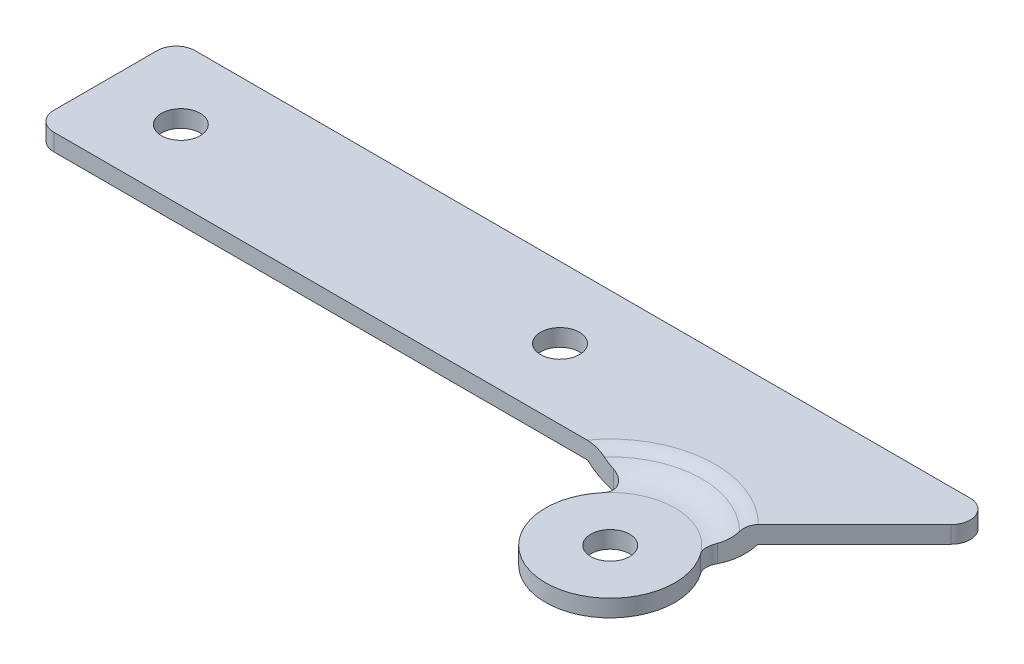
ISO-10303-21;
HEADER;
FILE_DESCRIPTION(('STEP AP214'),'2;1');
FILE_NAME('part.step','',(''),(''),'','','');
FILE_SCHEMA(('AUTOMOTIVE_DESIGN { 1 0 10303 214 1 1 1 1 }'));
ENDSEC;
DATA;
#1=APPLICATION_CONTEXT('core data for automotive mechanical design processes');
#2=APPLICATION_PROTOCOL_DEFINITION('international standard','automotive_design',2000,#1);
#3=PRODUCT_CONTEXT('',#1,'mechanical');
#4=PRODUCT('Part','Part','',(#3));
#5=PRODUCT_RELATED_PRODUCT_CATEGORY('part','',(#4));
#6=PRODUCT_DEFINITION_FORMATION('','',#4);
#7=PRODUCT_DEFINITION_CONTEXT('part definition',#1,'design');
#8=PRODUCT_DEFINITION('design','',#6,#7);
#9=PRODUCT_DEFINITION_SHAPE('','',#8);
#10=(LENGTH_UNIT() NAMED_UNIT(*) SI_UNIT(.MILLI.,.METRE.));
#11=(NAMED_UNIT(*) PLANE_ANGLE_UNIT() SI_UNIT($,.RADIAN.));
#12=(NAMED_UNIT(*) SI_UNIT($,.STERADIAN.) SOLID_ANGLE_UNIT());
#13=UNCERTAINTY_MEASURE_WITH_UNIT(LENGTH_MEASURE(1.E-05),#10,'distance_accuracy_value','');
#14=(GEOMETRIC_REPRESENTATION_CONTEXT(3) GLOBAL_UNCERTAINTY_ASSIGNED_CONTEXT((#13)) GLOBAL_UNIT_ASSIGNED_CONTEXT((#10,
#11,#12)) REPRESENTATION_CONTEXT('',''));
#15=CARTESIAN_POINT('',(0.,0.,0.));
#16=DIRECTION('',(0.,0.,1.));
#17=DIRECTION('',(1.,0.,0.));
#18=AXIS2_PLACEMENT_3D('',#15,#16,#17);
#19=CARTESIAN_POINT('',(44.4503952922486,-2.66700000003041,17.653));
#20=DIRECTION('',(0.,1.,0.));
#21=DIRECTION('',(0.,0.,1.));
#22=AXIS2_PLACEMENT_3D('',#19,#20,#21);
#23=CYLINDRICAL_SURFACE('',#22,2.6035);
#24=CARTESIAN_POINT('',(44.4503952922486,-2.41300000003041,17.653));
#25=DIRECTION('',(0.,1.,0.));
#26=DIRECTION('',(0.,0.,1.));
#27=AXIS2_PLACEMENT_3D('',#24,#25,#26);
#28=CIRCLE('',#27,2.6035);
#29=CARTESIAN_POINT('',(44.4503952922486,-2.41300000003041,20.2565));
#30=VERTEX_POINT('',#29);
#31=EDGE_CURVE('E474',#30,#30,#28,.T.);
#32=ORIENTED_EDGE('',*,*,#31,.F.);
#33=EDGE_LOOP('',(#32));
#34=FACE_BOUND('',#33,.T.);
#35=CARTESIAN_POINT('',(44.4503952922486,-0.12700000003041,17.653));
#36=DIRECTION('',(0.,1.,0.));
#37=DIRECTION('',(0.,0.,1.));
#38=AXIS2_PLACEMENT_3D('',#35,#36,#37);
#39=CIRCLE('',#38,2.6035);
#40=CARTESIAN_POINT('',(44.4503952922486,-0.12700000003041,20.2565));
#41=VERTEX_POINT('',#40);
#42=EDGE_CURVE('E20',#41,#41,#39,.T.);
#43=ORIENTED_EDGE('',*,*,#42,.T.);
#44=EDGE_LOOP('',(#43));
#45=FACE_BOUND('',#44,.T.);
#46=ADVANCED_FACE('F17',(#34,#45),#23,.F.);
#47=CARTESIAN_POINT('',(44.4503952922486,-0.12700000003041,17.653));
#48=DIRECTION('',(0.,-1.,0.));
#49=DIRECTION('',(0.,0.,-1.));
#50=AXIS2_PLACEMENT_3D('',#47,#48,#49);
#51=PLANE('',#50);
#52=CARTESIAN_POINT('',(44.4503952922486,-0.12700000003041,17.653));
#53=DIRECTION('',(0.,-1.,0.));
#54=DIRECTION('',(-0.760302428804956,0.,-0.649569254778337));
#55=AXIS2_PLACEMENT_3D('',#52,#53,#54);
#56=CIRCLE('',#55,8.67699443373865);
#57=CARTESIAN_POINT('',(51.4610548897929,-0.12700000003041,12.54018429723));
#58=VERTEX_POINT('',#57);
#59=CARTESIAN_POINT('',(37.85325534955,-0.12700000003041,12.0166911919606));
#60=VERTEX_POINT('',#59);
#61=EDGE_CURVE('E125',#58,#60,#56,.F.);
#62=ORIENTED_EDGE('',*,*,#61,.T.);
#63=CARTESIAN_POINT('',(44.4503952922486,-0.12700000003041,17.653));
#64=DIRECTION('',(0.,1.,0.));
#65=DIRECTION('',(0.,0.,1.));
#66=AXIS2_PLACEMENT_3D('',#63,#64,#65);
#67=CIRCLE('',#66,8.67699443373867);
#68=EDGE_CURVE('E120',#58,#60,#67,.F.);
#69=ORIENTED_EDGE('',*,*,#68,.F.);
#70=EDGE_LOOP('',(#62,#69));
#71=FACE_BOUND('',#70,.T.);
#72=ORIENTED_EDGE('',*,*,#42,.F.);
#73=EDGE_LOOP('',(#72));
#74=FACE_BOUND('',#73,.T.);
#75=ADVANCED_FACE('F122',(#71,#74),#51,.F.);
#76=CARTESIAN_POINT('',(44.4503952922486,-2.41300000003041,17.653));
#77=DIRECTION('',(0.,-1.,0.));
#78=DIRECTION('',(0.,0.,-1.));
#79=AXIS2_PLACEMENT_3D('',#76,#77,#78);
#80=PLANE('',#79);
#81=CARTESIAN_POINT('',(44.4503952922486,-2.41300000003041,17.653));
#82=DIRECTION('',(0.,1.,0.));
#83=DIRECTION('',(0.807959443915838,0.,-0.589238098723436));
#84=AXIS2_PLACEMENT_3D('',#81,#82,#83);
#85=CIRCLE('',#84,8.67699443373865);
#86=CARTESIAN_POINT('',(51.4610548897929,-2.41300000003041,12.54018429723));
#87=VERTEX_POINT('',#86);
#88=CARTESIAN_POINT('',(37.85325534955,-2.41300000003041,12.0166911919606));
#89=VERTEX_POINT('',#88);
#90=EDGE_CURVE('E247',#87,#89,#85,.T.);
#91=ORIENTED_EDGE('',*,*,#90,.F.);
#92=CARTESIAN_POINT('',(44.4503952922486,-2.41300000003041,17.653));
#93=DIRECTION('',(0.,1.,0.));
#94=DIRECTION('',(0.,0.,1.));
#95=AXIS2_PLACEMENT_3D('',#92,#93,#94);
#96=CIRCLE('',#95,8.67699443373867);
#97=EDGE_CURVE('E132',#89,#87,#96,.T.);
#98=ORIENTED_EDGE('',*,*,#97,.F.);
#99=EDGE_LOOP('',(#91,#98));
#100=FACE_BOUND('',#99,.T.);
#101=ORIENTED_EDGE('',*,*,#31,.T.);
#102=EDGE_LOOP('',(#101));
#103=FACE_BOUND('',#102,.T.);
#104=ADVANCED_FACE('F252',(#100,#103),#80,.T.);
#105=CARTESIAN_POINT('',(44.4503952922486,-2.41300000003041,17.653));
#106=DIRECTION('',(0.,1.,0.));
#107=DIRECTION('',(0.,0.,1.));
#108=AXIS2_PLACEMENT_3D('',#105,#106,#107);
#109=CYLINDRICAL_SURFACE('',#108,8.67699443373867);
#110=ORIENTED_EDGE('',*,*,#68,.T.);
#111=DIRECTION('',(0.,1.,0.));
#112=VECTOR('',#111,1.);
#113=CARTESIAN_POINT('',(37.85325534955,-2.41300000003041,12.0166911919606));
#114=LINE('',#113,#112);
#115=EDGE_CURVE('E403',#60,#89,#114,.F.);
#116=ORIENTED_EDGE('',*,*,#115,.T.);
#117=ORIENTED_EDGE('',*,*,#97,.T.);
#118=DIRECTION('',(0.,1.,0.));
#119=VECTOR('',#118,1.);
#120=CARTESIAN_POINT('',(51.4610548897929,-2.41300000003041,12.54018429723));
#121=LINE('',#120,#119);
#122=EDGE_CURVE('E135',#87,#58,#121,.T.);
#123=ORIENTED_EDGE('',*,*,#122,.T.);
#124=EDGE_LOOP('',(#110,#116,#117,#123));
#125=FACE_BOUND('',#124,.T.);
#126=ADVANCED_FACE('F136',(#125),#109,.T.);
#127=CARTESIAN_POINT('',(44.4503952922486,-0.10160000003041,17.653));
#128=DIRECTION('',(0.,1.,0.));
#129=DIRECTION('',(0.,0.,1.));
#130=AXIS2_PLACEMENT_3D('',#127,#128,#129);
#131=TOROIDAL_SURFACE('',#130,14.0384404886757,0.1016);
#132=CARTESIAN_POINT('',(44.4503952922486,-0.0342269503850086,17.653));
#133=DIRECTION('',(0.,1.,0.));
#134=DIRECTION('',(0.,0.,1.));
#135=AXIS2_PLACEMENT_3D('',#132,#133,#134);
#136=CIRCLE('',#135,13.9623916084639);
#137=CARTESIAN_POINT('',(33.1896957390192,-0.0342269503850142,9.398));
#138=VERTEX_POINT('',#137);
#139=CARTESIAN_POINT('',(54.3232970801755,-0.0342269503850124,7.78009821207306));
#140=VERTEX_POINT('',#139);
#141=EDGE_CURVE('E156',#138,#140,#136,.F.);
#142=ORIENTED_EDGE('',*,*,#141,.F.);
#143=CARTESIAN_POINT('',(33.0955379019468,-3.04095941136562E-11,9.398));
#144=CARTESIAN_POINT('',(33.1043058847219,-4.27830514717296E-06,9.39800000000726));
#145=CARTESIAN_POINT('',(33.1130825409415,-0.000743526853356374,9.39800000000448));
#146=CARTESIAN_POINT('',(33.1300958473547,-0.0036709579785329,9.39799999999567));
#147=CARTESIAN_POINT('',(33.1383407823322,-0.00581152404819654,9.39799999998976));
#148=CARTESIAN_POINT('',(33.1541613388357,-0.0114570274934798,9.39799999998993));
#149=CARTESIAN_POINT('',(33.161747607659,-0.0149313235804316,9.39799999999576));
#150=CARTESIAN_POINT('',(33.176344334753,-0.0233994876074103,9.39800000000438));
#151=CARTESIAN_POINT('',(33.1833280256187,-0.028439120987053,9.39800000000707));
#152=CARTESIAN_POINT('',(33.1896957390192,-0.0342269503850202,9.398));
#153=B_SPLINE_CURVE_WITH_KNOTS('',3,(#143,#144,#145,#146,#147,#148,#149,#150,#151,#152),
.UNSPECIFIED.,.F.,.F.,(4,2,2,2,4),(0.,0.0262859342628319,0.0517220480256204,0.07660573628006,
0.102299088490653),.UNSPECIFIED.);
#154=CARTESIAN_POINT('',(33.0955379019468,-2.41195518418946E-11,9.398));
#155=VERTEX_POINT('',#154);
#156=EDGE_CURVE('E131',#155,#138,#153,.T.);
#157=ORIENTED_EDGE('',*,*,#156,.F.);
#158=CARTESIAN_POINT('',(44.4503952922486,-3.04095941136562E-11,17.653));
#159=DIRECTION('',(0.,-1.,0.));
#160=DIRECTION('',(-0.808840369374453,0.,-0.588028278971512));
#161=AXIS2_PLACEMENT_3D('',#158,#159,#160);
#162=CIRCLE('',#161,14.0384404886757);
#163=CARTESIAN_POINT('',(54.377071759075,-2.43275451866642E-11,7.72632353317358));
#164=VERTEX_POINT('',#163);
#165=EDGE_CURVE('E400',#155,#164,#162,.T.);
#166=ORIENTED_EDGE('',*,*,#165,.T.);
#167=CARTESIAN_POINT('',(54.3232970801755,-0.0342269503850163,7.78009821207306));
#168=CARTESIAN_POINT('',(54.325973634849,-0.0299468639125701,7.77742165739962));
#169=CARTESIAN_POINT('',(54.3289096105983,-0.0259938620795694,7.77448568165028));
#170=CARTESIAN_POINT('',(54.3352073993302,-0.0188372784984353,7.76818789291843));
#171=CARTESIAN_POINT('',(54.3385691977223,-0.0156336710837642,7.76482609452631));
#172=CARTESIAN_POINT('',(54.3456283380042,-0.010068838204077,7.75776695424438));
#173=CARTESIAN_POINT('',(54.3493259173711,-0.00770821484155102,7.75406937487751));
#174=CARTESIAN_POINT('',(54.3569435989417,-0.0039026409279243,7.74645169330685));
#175=CARTESIAN_POINT('',(54.360863384598,-0.0024564217750087,7.7425319076506));
#176=CARTESIAN_POINT('',(54.3688777722828,-0.000495469669809619,7.73451751996583));
#177=CARTESIAN_POINT('',(54.3729741066018,5.10062787855953E-06,7.73042118564679));
#178=CARTESIAN_POINT('',(54.377071759075,-3.04095941136562E-11,7.72632353317359));
#179=B_SPLINE_CURVE_WITH_KNOTS('',3,(#167,#168,#169,#170,#171,#172,#173,#174,#175,#176,#177,
#178),.UNSPECIFIED.,.F.,.F.,(4,2,2,2,2,4),(0.,0.0171183283748688,0.0342360703661676,
0.0513660143879239,0.0684721406731554,0.0858324888539476),.UNSPECIFIED.);
#180=EDGE_CURVE('E97',#140,#164,#179,.T.);
#181=ORIENTED_EDGE('',*,*,#180,.F.);
#182=EDGE_LOOP('',(#142,#157,#166,#181));
#183=FACE_BOUND('',#182,.T.);
#184=ADVANCED_FACE('F220',(#183),#131,.F.);
#185=CARTESIAN_POINT('',(44.4503952922486,4.64819999996959,17.653));
#186=DIRECTION('',(0.,1.,0.));
#187=DIRECTION('',(0.,0.,1.));
#188=AXIS2_PLACEMENT_3D('',#185,#186,#187);
#189=TOROIDAL_SURFACE('',#188,8.67699443373867,4.7752);
#190=CARTESIAN_POINT('',(44.4503952922486,1.48166666663626,17.653));
#191=DIRECTION('',(0.,1.,0.));
#192=DIRECTION('',(0.,0.,1.));
#193=AXIS2_PLACEMENT_3D('',#190,#191,#192);
#194=CIRCLE('',#193,12.2512918036967);
#195=CARTESIAN_POINT('',(35.3978196444384,1.48166666663626,9.398));
#196=VERTEX_POINT('',#195);
#197=CARTESIAN_POINT('',(53.1133668049377,1.48166666663626,8.99002848731088));
#198=VERTEX_POINT('',#197);
#199=EDGE_CURVE('E362',#196,#198,#194,.F.);
#200=ORIENTED_EDGE('',*,*,#199,.F.);
#201=CARTESIAN_POINT('',(36.6462752438221,0.697999556154319,9.39800000000001));
#202=CARTESIAN_POINT('',(36.5902691154025,0.724131846142791,9.398));
#203=CARTESIAN_POINT('',(36.5346331071177,0.751061988669068,9.398));
#204=CARTESIAN_POINT('',(36.4243419247119,0.806465591426128,9.398));
#205=CARTESIAN_POINT('',(36.3696843301863,0.834934235464384,9.398));
#206=CARTESIAN_POINT('',(36.2613709557785,0.89345578905965,9.398));
#207=CARTESIAN_POINT('',(36.2077133161656,0.923505252817489,9.398));
#208=CARTESIAN_POINT('',(36.1014240037671,0.985232372130996,9.398));
#209=CARTESIAN_POINT('',(36.0487912313239,1.01690813289204,9.398));
#210=CARTESIAN_POINT('',(35.9445605804883,1.08194764649301,9.398));
#211=CARTESIAN_POINT('',(35.8929629565739,1.11531180747219,9.398));
#212=CARTESIAN_POINT('',(35.7908560301176,1.18376895949815,9.398));
#213=CARTESIAN_POINT('',(35.740347804385,1.21886355767911,9.398));
#214=CARTESIAN_POINT('',(35.6404593960771,1.29083747221313,9.398));
#215=CARTESIAN_POINT('',(35.5910817612592,1.32772032800084,9.398));
#216=CARTESIAN_POINT('',(35.4934995257495,1.40333131706467,9.398));
#217=CARTESIAN_POINT('',(35.4452993329232,1.44206513717306,9.398));
#218=CARTESIAN_POINT('',(35.3978196444384,1.48166666663627,9.398));
#219=B_SPLINE_CURVE_WITH_KNOTS('',3,(#201,#202,#203,#204,#205,#206,#207,#208,#209,#210,#211,
#212,#213,#214,#215,#216,#217,#218),.UNSPECIFIED.,.F.,.F.,(4,2,2,2,2,2,2,2,4),(0.,
0.185404947511082,0.370259787606953,0.554727160050261,0.738984282775707,0.923286160990429,
1.10776255686208,1.29262030634036,1.47808797916946),.UNSPECIFIED.);
#220=CARTESIAN_POINT('',(36.6462752438221,0.697999556154319,9.39799999999999));
#221=VERTEX_POINT('',#220);
#222=EDGE_CURVE('E141',#221,#196,#219,.T.);
#223=ORIENTED_EDGE('',*,*,#222,.F.);
#224=CARTESIAN_POINT('',(36.6462752438221,0.697999556154319,9.39800000000001));
#225=CARTESIAN_POINT('',(36.6954210013177,0.675063643181901,9.39800731595386));
#226=CARTESIAN_POINT('',(36.7443966959179,0.651836918608933,9.40028281796986));
#227=CARTESIAN_POINT('',(36.8417953074949,0.605093630537735,9.4093251371386));
#228=CARTESIAN_POINT('',(36.89021819955,0.581577054070845,9.4160921559736));
#229=CARTESIAN_POINT('',(37.0345808809508,0.51091161026325,9.44310915389445));
#230=CARTESIAN_POINT('',(37.1293578613771,0.463768871820712,9.47007462826116));
#231=CARTESIAN_POINT('',(37.3133648358822,0.371816217971903,9.54157934405963));
#232=CARTESIAN_POINT('',(37.4025889379622,0.327008788418542,9.5861368959307));
#233=CARTESIAN_POINT('',(37.5725209269125,0.2418641332829,9.6923514494021));
#234=CARTESIAN_POINT('',(37.6532404450279,0.201520798509035,9.75398466729897));
#235=CARTESIAN_POINT('',(37.7985409829568,0.129255662404161,9.88927349239074));
#236=CARTESIAN_POINT('',(37.8637872709705,0.0969806986215687,9.96202226782616));
#237=CARTESIAN_POINT('',(37.9807265445643,0.0391575245994266,10.1200340583203));
#238=CARTESIAN_POINT('',(38.0324286863406,0.0136047699215306,10.2052885580466));
#239=CARTESIAN_POINT('',(38.1146351216927,-0.027869454330366,10.3755687380503));
#240=CARTESIAN_POINT('',(38.1468426183701,-0.0445399665766348,10.4595935831571));
#241=CARTESIAN_POINT('',(38.1966936238954,-0.0724101528164512,10.6327079866901));
#242=CARTESIAN_POINT('',(38.2143420543181,-0.0836116750348729,10.7217958227189));
#243=CARTESIAN_POINT('',(38.233653947553,-0.100882463429269,10.897336785339));
#244=CARTESIAN_POINT('',(38.2361121384784,-0.107191463088085,10.9836806989688));
#245=CARTESIAN_POINT('',(38.2269644117221,-0.116659444868228,11.1558110993786));
#246=CARTESIAN_POINT('',(38.2153551802238,-0.119817684455734,11.2415974500286));
#247=CARTESIAN_POINT('',(38.1781209710865,-0.124157968136224,11.4112282797477));
#248=CARTESIAN_POINT('',(38.1523232863872,-0.125314917491321,11.4950352823032));
#249=CARTESIAN_POINT('',(38.0872993567579,-0.126664100638174,11.6572312982398));
#250=CARTESIAN_POINT('',(38.0480852732104,-0.126857205650325,11.7356251413394));
#251=CARTESIAN_POINT('',(37.9806296323382,-0.126978587472762,11.8465893535157));
#252=CARTESIAN_POINT('',(37.9570513277046,-0.126991838333452,11.8820691545091));
#253=CARTESIAN_POINT('',(37.9071673475522,-0.12700048874235,11.9509587041512));
#254=CARTESIAN_POINT('',(37.8808666884454,-0.126995920574643,11.9843720851717));
#255=CARTESIAN_POINT('',(37.85325534955,-0.12700000003041,12.0166911919606));
#256=B_SPLINE_CURVE_WITH_KNOTS('',3,(#224,#225,#226,#227,#228,#229,#230,#231,#232,#233,#234,
#235,#236,#237,#238,#239,#240,#241,#242,#243,#244,#245,#246,#247,#248,#249,#250,#251,#252,#253,
#254,#255),.UNSPECIFIED.,.F.,.F.,(4,2,2,2,2,2,2,2,2,2,2,2,2,2,2,4),(0.,0.162595356457138,
0.325198014416031,0.65124558344868,0.97763341245052,1.30356890068229,1.61056275914888,
1.91734854304302,2.19048031928464,2.46351972765564,2.72214414748222,2.98082950246151,
3.24273568762656,3.50440509245851,3.6320867667033,3.75953721792548),.UNSPECIFIED.);
#257=EDGE_CURVE('E149',#221,#60,#256,.T.);
#258=ORIENTED_EDGE('',*,*,#257,.T.);
#259=ORIENTED_EDGE('',*,*,#61,.F.);
#260=CARTESIAN_POINT('',(51.4610548897929,-0.12700000003041,12.54018429723));
#261=CARTESIAN_POINT('',(51.4347952435241,-0.126993576169972,12.5041844237732));
#262=CARTESIAN_POINT('',(51.4100594557561,-0.126999840389627,12.4670757328376));
#263=CARTESIAN_POINT('',(51.3637935731327,-0.126990895771473,12.3909129511888));
#264=CARTESIAN_POINT('',(51.3422633536243,-0.126975687768884,12.3518589362012));
#265=CARTESIAN_POINT('',(51.3025689666508,-0.126876967346128,12.2720838432183));
#266=CARTESIAN_POINT('',(51.2844040455595,-0.126793470241382,12.2313631409614));
#267=CARTESIAN_POINT('',(51.2515635702301,-0.12646795458767,12.148552186645));
#268=CARTESIAN_POINT('',(51.236887972795,-0.126225938001275,12.1064619515473));
#269=CARTESIAN_POINT('',(51.1982494269307,-0.125094236049684,11.9785188763009));
#270=CARTESIAN_POINT('',(51.179664163295,-0.123798984730494,11.890972393628));
#271=CARTESIAN_POINT('',(51.1574552766642,-0.118970447290143,11.7141369859358));
#272=CARTESIAN_POINT('',(51.1538253635298,-0.115438102799588,11.6248488093433));
#273=CARTESIAN_POINT('',(51.1615071822012,-0.104910519918037,11.4478162466703));
#274=CARTESIAN_POINT('',(51.1727004199007,-0.0979430199973767,11.3600652312143));
#275=CARTESIAN_POINT('',(51.2093376710495,-0.0794880461825213,11.1880570011626));
#276=CARTESIAN_POINT('',(51.2347840348522,-0.0679998269105957,11.1038003652552));
#277=CARTESIAN_POINT('',(51.2980937114425,-0.0401463988706412,10.9431802392321));
#278=CARTESIAN_POINT('',(51.3356708284695,-0.0238943252310572,10.8666836617983));
#279=CARTESIAN_POINT('',(51.4218273784822,0.0137310345407449,10.7216306995218));
#280=CARTESIAN_POINT('',(51.4703936250436,0.0350981845956228,10.6530649458814));
#281=CARTESIAN_POINT('',(51.5390102706255,0.0658000581678471,10.5706039560829));
#282=CARTESIAN_POINT('',(51.5549481803034,0.0729625340841652,10.5523264539436));
#283=CARTESIAN_POINT('',(51.5875287303717,0.0876713433967695,10.5166388806914));
#284=CARTESIAN_POINT('',(51.6041700151685,0.0952169435970169,10.4992272702199));
#285=CARTESIAN_POINT('',(51.6211584918745,0.102955193081917,10.482236800372));
#286=B_SPLINE_CURVE_WITH_KNOTS('',3,(#260,#261,#262,#263,#264,#265,#266,#267,#268,#269,#270,
#271,#272,#273,#274,#275,#276,#277,#278,#279,#280,#281,#282,#283,#284,#285),.UNSPECIFIED.,.F.,
.F.,(4,2,2,2,2,2,2,2,2,2,2,2,4),(0.,0.133635525210901,0.26726585245542,0.40086621820331,
0.534464929925055,0.801591999641597,1.06860670568735,1.33349976697925,1.5984365222408,
1.85753083598403,2.11631588249818,2.19215663343422,2.2678573476963),.UNSPECIFIED.);
#287=CARTESIAN_POINT('',(51.6211584918751,0.102955193081946,10.4822368003725));
#288=VERTEX_POINT('',#287);
#289=EDGE_CURVE('E140',#58,#288,#286,.T.);
#290=ORIENTED_EDGE('',*,*,#289,.T.);
#291=CARTESIAN_POINT('',(53.1133668049377,1.48166666663626,8.99002848731088));
#292=CARTESIAN_POINT('',(53.0497322459138,1.3800625699646,9.05366304633481));
#293=CARTESIAN_POINT('',(52.983019935166,1.28231635857511,9.12037535708255));
#294=CARTESIAN_POINT('',(52.8439397243862,1.09517938502789,9.25945556786241));
#295=CARTESIAN_POINT('',(52.7715703784005,1.00579077200134,9.33182491384806));
#296=CARTESIAN_POINT('',(52.623353614427,0.837923915497623,9.4800416778216));
#297=CARTESIAN_POINT('',(52.5476173819415,0.759249284267574,9.55577791030707));
#298=CARTESIAN_POINT('',(52.3918064495921,0.611125458109484,9.71158884265646));
#299=CARTESIAN_POINT('',(52.3117333955879,0.541672797430707,9.79166189666065));
#300=CARTESIAN_POINT('',(52.1336200102782,0.401294176843487,9.96977528197037));
#301=CARTESIAN_POINT('',(52.0348626495809,0.332179913405805,10.0685326426677));
#302=CARTESIAN_POINT('',(51.8317276911468,0.207075407463616,10.2716676011018));
#303=CARTESIAN_POINT('',(51.7272932743001,0.151269649615773,10.3761020179485));
#304=CARTESIAN_POINT('',(51.6211584918757,0.102955193081965,10.4822368003729));
#305=B_SPLINE_CURVE_WITH_KNOTS('',3,(#291,#292,#293,#294,#295,#296,#297,#298,#299,#300,#301,
#302,#303,#304),.UNSPECIFIED.,.F.,.F.,(4,2,2,2,2,2,4),(0.,0.407058804524104,0.814221996750508,
1.21244954215882,1.61052700169595,2.07725848029546,2.55012599001399),.UNSPECIFIED.);
#306=EDGE_CURVE('E359',#198,#288,#305,.T.);
#307=ORIENTED_EDGE('',*,*,#306,.F.);
#308=EDGE_LOOP('',(#200,#223,#258,#259,#290,#307));
#309=FACE_BOUND('',#308,.T.);
#310=ADVANCED_FACE('F146',(#309),#189,.F.);
#311=CARTESIAN_POINT('',(52.7436905070093,-2.41300000003041,11.6047688155065));
#312=DIRECTION('',(0.,1.,0.));
#313=DIRECTION('',(0.,0.,1.));
#314=AXIS2_PLACEMENT_3D('',#311,#312,#313);
#315=CYLINDRICAL_SURFACE('',#314,1.5875);
#316=DIRECTION('',(0.,1.,0.));
#317=VECTOR('',#316,1.);
#318=CARTESIAN_POINT('',(51.6211584918756,2.286,10.4822368003729));
#319=LINE('',#318,#317);
#320=CARTESIAN_POINT('',(51.6211584918756,-2.25956814571531,10.4822368003729));
#321=VERTEX_POINT('',#320);
#322=EDGE_CURVE('E154',#288,#321,#319,.F.);
#323=ORIENTED_EDGE('',*,*,#322,.F.);
#324=ORIENTED_EDGE('',*,*,#289,.F.);
#325=ORIENTED_EDGE('',*,*,#122,.F.);
#326=CARTESIAN_POINT('',(51.6211584918756,-2.25956814571531,10.4822368003729));
#327=CARTESIAN_POINT('',(51.590473619888,-2.26876697908095,10.5129219730939));
#328=CARTESIAN_POINT('',(51.5609983477627,-2.27754895503426,10.5449152356508));
#329=CARTESIAN_POINT('',(51.5046702811015,-2.29424437852611,10.6113483941292));
#330=CARTESIAN_POINT('',(51.4778177321217,-2.30215774474842,10.645788518621));
#331=CARTESIAN_POINT('',(51.4015779054809,-2.3245195622886,10.752417268703));
#332=CARTESIAN_POINT('',(51.3564223107895,-2.33761541005459,10.8280002430247));
#333=CARTESIAN_POINT('',(51.2790519676684,-2.36014179061674,10.9860973119359));
#334=CARTESIAN_POINT('',(51.2468526373931,-2.36956795600375,11.0686195240355));
#335=CARTESIAN_POINT('',(51.1965846773914,-2.3850724631475,11.2381270113683));
#336=CARTESIAN_POINT('',(51.1785091938078,-2.39115242828565,11.3251101000135));
#337=CARTESIAN_POINT('',(51.1572185821754,-2.40055201739991,11.5001000445791));
#338=CARTESIAN_POINT('',(51.153852626479,-2.40389937032048,11.5880871891045));
#339=CARTESIAN_POINT('',(51.161708466494,-2.40872871924282,11.7635186965492));
#340=CARTESIAN_POINT('',(51.1729400383739,-2.41020946384211,11.8509626562682));
#341=CARTESIAN_POINT('',(51.2098634905342,-2.41211759678413,12.0235745277887));
#342=CARTESIAN_POINT('',(51.235686899425,-2.41253521103583,12.1087142499874));
#343=CARTESIAN_POINT('',(51.3011535082902,-2.41297114569377,12.2733996922009));
#344=CARTESIAN_POINT('',(51.3407716375562,-2.41299018666137,12.3529552479044));
#345=CARTESIAN_POINT('',(51.398275120364,-2.41299849800293,12.4476911652213));
#346=CARTESIAN_POINT('',(51.4102926338021,-2.41299938180028,12.4665744242925));
#347=CARTESIAN_POINT('',(51.4350975658723,-2.41300022059359,12.5037895874197));
#348=CARTESIAN_POINT('',(51.4478838659454,-2.41300017690788,12.5221222369806));
#349=CARTESIAN_POINT('',(51.4610548897927,-2.41300000003041,12.5401842972301));
#350=B_SPLINE_CURVE_WITH_KNOTS('',3,(#326,#327,#328,#329,#330,#331,#332,#333,#334,#335,#336,
#337,#338,#339,#340,#341,#342,#343,#344,#345,#346,#347,#348,#349),.UNSPECIFIED.,.F.,.F.,(4,2,2,
2,2,2,2,2,2,2,2,4),(0.,0.133002458630624,0.266017357890485,0.531678698952273,0.797655252717406,
1.06350265615488,1.32661763670419,1.58990891987221,1.85561222044712,2.12083512729617,
2.18797227958883,2.25501400848875),.UNSPECIFIED.);
#351=EDGE_CURVE('E158',#321,#87,#350,.T.);
#352=ORIENTED_EDGE('',*,*,#351,.F.);
#353=EDGE_LOOP('',(#323,#324,#325,#352));
#354=FACE_BOUND('',#353,.T.);
#355=ADVANCED_FACE('F152',(#354),#315,.F.);
#356=CARTESIAN_POINT('',(44.4503952922486,4.64819999996959,17.653));
#357=DIRECTION('',(0.,1.,0.));
#358=DIRECTION('',(0.,0.,1.));
#359=AXIS2_PLACEMENT_3D('',#356,#357,#358);
#360=TOROIDAL_SURFACE('',#359,8.67699443373867,7.0612);
#361=CARTESIAN_POINT('',(37.85325534955,-2.41300000003041,12.0166911919606));
#362=CARTESIAN_POINT('',(37.8822399801254,-2.41299656145982,11.9827650366654));
#363=CARTESIAN_POINT('',(37.9097798997594,-2.41300035391785,11.9476326896234));
#364=CARTESIAN_POINT('',(37.9618059294701,-2.41299335372206,11.8751776966399));
#365=CARTESIAN_POINT('',(37.9862921732067,-2.41298256170685,11.8378551466695));
#366=CARTESIAN_POINT('',(38.0548639607022,-2.41288483491481,11.7230369835563));
#367=CARTESIAN_POINT('',(38.0941438961141,-2.41273270090005,11.6425954690923));
#368=CARTESIAN_POINT('',(38.1586507183666,-2.41170395339247,11.4762632866642));
#369=CARTESIAN_POINT('',(38.183870193205,-2.41082695839116,11.3903697711881));
#370=CARTESIAN_POINT('',(38.2195374965038,-2.40755355376761,11.2156046156912));
#371=CARTESIAN_POINT('',(38.2299893395239,-2.40515755734045,11.1267337917753));
#372=CARTESIAN_POINT('',(38.2358361307235,-2.39800351885394,10.9489131377669));
#373=CARTESIAN_POINT('',(38.231285291383,-2.39325403393995,10.8599647507378));
#374=CARTESIAN_POINT('',(38.2074540726679,-2.38065918723952,10.6842794011772));
#375=CARTESIAN_POINT('',(38.1881732038192,-2.37281372257888,10.5975425122319));
#376=CARTESIAN_POINT('',(38.1358828502527,-2.35364774330909,10.4297415081447));
#377=CARTESIAN_POINT('',(38.103020787721,-2.34236487683622,10.3486270799451));
#378=CARTESIAN_POINT('',(38.0247563161692,-2.31615995088938,10.1933470159967));
#379=CARTESIAN_POINT('',(37.97935429845,-2.30123800497215,10.119181163519));
#380=CARTESIAN_POINT('',(37.8772356197002,-2.26785424035332,9.97929991995351));
#381=CARTESIAN_POINT('',(37.8204520258506,-2.24937150758591,9.9136384913146));
#382=CARTESIAN_POINT('',(37.6975248365339,-2.20942785197898,9.7928301107711));
#383=CARTESIAN_POINT('',(37.6313793175245,-2.18796631711928,9.73768532514178));
#384=CARTESIAN_POINT('',(37.4889757435166,-2.1419509718125,9.63720877673361));
#385=CARTESIAN_POINT('',(37.4124314802008,-2.11731137977341,9.59232256416344));
#386=CARTESIAN_POINT('',(37.2533390009948,-2.06661146026912,9.51600528390614));
#387=CARTESIAN_POINT('',(37.170790371016,-2.04055103484787,9.48457514524246));
#388=CARTESIAN_POINT('',(37.0149126795995,-1.99222809275233,9.43960843656498));
#389=CARTESIAN_POINT('',(36.9421471130521,-1.97000543455365,9.4240488670552));
#390=CARTESIAN_POINT('',(36.795083077898,-1.92611915795541,9.40324552473374));
#391=CARTESIAN_POINT('',(36.7207864028513,-1.90445494568515,9.39799030609379));
#392=CARTESIAN_POINT('',(36.6462752438221,-1.88342261208621,9.398));
#393=B_SPLINE_CURVE_WITH_KNOTS('',3,(#361,#362,#363,#364,#365,#366,#367,#368,#369,#370,#371,
#372,#373,#374,#375,#376,#377,#378,#379,#380,#381,#382,#383,#384,#385,#386,#387,#388,#389,#390,
#391,#392),.UNSPECIFIED.,.F.,.F.,(4,2,2,2,2,2,2,2,2,2,2,2,2,2,2,4),(0.,0.133782854775081,
0.267559851789285,0.534742553649618,0.802065968599255,1.06931669806774,1.3356027719386,
1.60189769479309,1.86537493105362,2.1288439466127,2.39391040206322,2.65903139850863,
2.93409470785859,3.20917700484737,3.44146576522838,3.67349635827373),.UNSPECIFIED.);
#394=CARTESIAN_POINT('',(36.6462752438221,-1.88342261208621,9.398));
#395=VERTEX_POINT('',#394);
#396=EDGE_CURVE('E409',#89,#395,#393,.T.);
#397=ORIENTED_EDGE('',*,*,#396,.T.);
#398=CARTESIAN_POINT('',(33.1896957390192,-0.0342269503850121,9.398));
#399=CARTESIAN_POINT('',(33.309184548041,-0.143019797463723,9.398));
#400=CARTESIAN_POINT('',(33.4323359881504,-0.247746106593866,9.398));
#401=CARTESIAN_POINT('',(33.6850299171103,-0.448839717821114,9.398));
#402=CARTESIAN_POINT('',(33.8145639502821,-0.545217636345451,9.398));
#403=CARTESIAN_POINT('',(34.0793623331157,-0.729642735477883,9.398));
#404=CARTESIAN_POINT('',(34.2146249833065,-0.81769236206744,9.398));
#405=CARTESIAN_POINT('',(34.4877291969917,-0.984025218323823,9.398));
#406=CARTESIAN_POINT('',(34.6254821375913,-1.06245426802723,9.398));
#407=CARTESIAN_POINT('',(34.9052000583578,-1.21144169194825,9.398));
#408=CARTESIAN_POINT('',(35.0471657040402,-1.28199881410246,9.398));
#409=CARTESIAN_POINT('',(35.3346214859613,-1.4153843694714,9.398));
#410=CARTESIAN_POINT('',(35.4801105492538,-1.47821512095203,9.398));
#411=CARTESIAN_POINT('',(35.7930413014898,-1.60403701838155,9.398));
#412=CARTESIAN_POINT('',(35.9608940437835,-1.66600354427327,9.398));
#413=CARTESIAN_POINT('',(36.3008479467169,-1.78128114646283,9.398));
#414=CARTESIAN_POINT('',(36.472970464693,-1.83452937873956,9.398));
#415=CARTESIAN_POINT('',(36.6462752438221,-1.8834226120862,9.39799999999999));
#416=B_SPLINE_CURVE_WITH_KNOTS('',3,(#398,#399,#400,#401,#402,#403,#404,#405,#406,#407,#408,
#409,#410,#411,#412,#413,#414,#415),.UNSPECIFIED.,.F.,.F.,(4,2,2,2,2,2,2,2,4),(0.,
0.48465453464694,0.968683410578139,1.45256968513057,1.92785184280186,2.40320948866393,
2.87842415558413,3.41493394637438,3.95515531087969),.UNSPECIFIED.);
#417=EDGE_CURVE('E336',#138,#395,#416,.T.);
#418=ORIENTED_EDGE('',*,*,#417,.F.);
#419=ORIENTED_EDGE('',*,*,#141,.T.);
#420=CARTESIAN_POINT('',(51.6211584918757,-2.25956814571531,10.4822368003729));
#421=CARTESIAN_POINT('',(51.7603045683477,-2.21788674236587,10.3430907239009));
#422=CARTESIAN_POINT('',(51.8981838577658,-2.16775303561885,10.2052114344828));
#423=CARTESIAN_POINT('',(52.1704197812672,-2.05104424876381,9.93297551098143));
#424=CARTESIAN_POINT('',(52.3047763870229,-1.98446903648691,9.79861890522571));
#425=CARTESIAN_POINT('',(52.5655308538123,-1.83728554838524,9.53786443843624));
#426=CARTESIAN_POINT('',(52.6920448910462,-1.75708848162004,9.41135040120234));
#427=CARTESIAN_POINT('',(52.9399093043177,-1.58210651779364,9.1634859879309));
#428=CARTESIAN_POINT('',(53.0612603380869,-1.48732348603137,9.04213495416168));
#429=CARTESIAN_POINT('',(53.284879545404,-1.29507683956906,8.81851574684459));
#430=CARTESIAN_POINT('',(53.3877745398704,-1.19906708567757,8.71562075237823));
#431=CARTESIAN_POINT('',(53.5882639786792,-0.996549887399519,8.5151313135694));
#432=CARTESIAN_POINT('',(53.6858584926346,-0.890042580932492,8.41753679961401));
#433=CARTESIAN_POINT('',(53.8774625710034,-0.664457128941362,8.22593272124523));
#434=CARTESIAN_POINT('',(53.9713316036533,-0.545140192599598,8.13206368859532));
#435=CARTESIAN_POINT('',(54.1524306431356,-0.296792408721667,7.95096464911302));
#436=CARTESIAN_POINT('',(54.2396598260079,-0.167760359545341,7.86373546624067));
#437=CARTESIAN_POINT('',(54.3232970801755,-0.0342269503850173,7.78009821207306));
#438=B_SPLINE_CURVE_WITH_KNOTS('',3,(#420,#421,#422,#423,#424,#425,#426,#427,#428,#429,#430,
#431,#432,#433,#434,#435,#436,#437),.UNSPECIFIED.,.F.,.F.,(4,2,2,2,2,2,2,2,4),(0.,
0.603261737167169,1.20652832395202,1.79406362940766,2.38152386134998,2.90406148649679,
3.42659224732596,3.96155470220786,4.49658343442055),.UNSPECIFIED.);
#439=EDGE_CURVE('E355',#321,#140,#438,.T.);
#440=ORIENTED_EDGE('',*,*,#439,.F.);
#441=ORIENTED_EDGE('',*,*,#351,.T.);
#442=ORIENTED_EDGE('',*,*,#90,.T.);
#443=EDGE_LOOP('',(#397,#418,#419,#440,#441,#442));
#444=FACE_BOUND('',#443,.T.);
#445=ADVANCED_FACE('F188',(#444),#360,.T.);
#446=CARTESIAN_POINT('',(36.6462752438221,-2.41300000003041,10.9855));
#447=DIRECTION('',(0.,1.,0.));
#448=DIRECTION('',(0.,0.,1.));
#449=AXIS2_PLACEMENT_3D('',#446,#447,#448);
#450=CYLINDRICAL_SURFACE('',#449,1.5875);
#451=ORIENTED_EDGE('',*,*,#115,.F.);
#452=ORIENTED_EDGE('',*,*,#257,.F.);
#453=DIRECTION('',(0.,-1.,0.));
#454=VECTOR('',#453,1.);
#455=CARTESIAN_POINT('',(36.6462752438221,2.286,9.398));
#456=LINE('',#455,#454);
#457=EDGE_CURVE('E332',#395,#221,#456,.F.);
#458=ORIENTED_EDGE('',*,*,#457,.F.);
#459=ORIENTED_EDGE('',*,*,#396,.F.);
#460=EDGE_LOOP('',(#451,#452,#458,#459));
#461=FACE_BOUND('',#460,.T.);
#462=ADVANCED_FACE('F194',(#461),#450,.F.);
#463=CARTESIAN_POINT('',(44.4503952922486,0.,17.653));
#464=DIRECTION('',(0.,1.,0.));
#465=DIRECTION('',(0.,0.,1.));
#466=AXIS2_PLACEMENT_3D('',#463,#464,#465);
#467=PLANE('',#466);
#468=CARTESIAN_POINT('',(-30.734,0.,0.));
#469=DIRECTION('',(0.,1.,0.));
#470=DIRECTION('',(0.,0.,1.));
#471=AXIS2_PLACEMENT_3D('',#468,#469,#470);
#472=CIRCLE('',#471,2.6035);
#473=CARTESIAN_POINT('',(-30.734,0.,2.6035));
#474=VERTEX_POINT('',#473);
#475=EDGE_CURVE('E490',#474,#474,#472,.T.);
#476=ORIENTED_EDGE('',*,*,#475,.T.);
#477=EDGE_LOOP('',(#476));
#478=FACE_BOUND('',#477,.T.);
#479=CARTESIAN_POINT('',(20.066,0.,0.));
#480=DIRECTION('',(0.,1.,0.));
#481=DIRECTION('',(0.,0.,1.));
#482=AXIS2_PLACEMENT_3D('',#479,#480,#481);
#483=CIRCLE('',#482,2.6035);
#484=CARTESIAN_POINT('',(20.066,0.,2.6035));
#485=VERTEX_POINT('',#484);
#486=EDGE_CURVE('E329',#485,#485,#483,.T.);
#487=ORIENTED_EDGE('',*,*,#486,.T.);
#488=EDGE_LOOP('',(#487));
#489=FACE_BOUND('',#488,.T.);
#490=ORIENTED_EDGE('',*,*,#165,.F.);
#491=DIRECTION('',(1.,0.,0.));
#492=VECTOR('',#491,1.);
#493=CARTESIAN_POINT('',(41.1508385038299,0.,9.398));
#494=LINE('',#493,#492);
#495=CARTESIAN_POINT('',(-38.3536047077515,0.,9.398));
#496=VERTEX_POINT('',#495);
#497=EDGE_CURVE('E326',#496,#155,#494,.T.);
#498=ORIENTED_EDGE('',*,*,#497,.F.);
#499=CARTESIAN_POINT('',(-38.3536047077515,0.,6.858));
#500=DIRECTION('',(0.,1.,0.));
#501=DIRECTION('',(0.,0.,1.));
#502=AXIS2_PLACEMENT_3D('',#499,#500,#501);
#503=CIRCLE('',#502,2.54);
#504=CARTESIAN_POINT('',(-40.8936047077515,0.,6.858));
#505=VERTEX_POINT('',#504);
#506=EDGE_CURVE('E340',#505,#496,#503,.T.);
#507=ORIENTED_EDGE('',*,*,#506,.F.);
#508=DIRECTION('',(0.,0.,1.));
#509=VECTOR('',#508,1.);
#510=CARTESIAN_POINT('',(-40.8936047077515,0.,9.398));
#511=LINE('',#510,#509);
#512=CARTESIAN_POINT('',(-40.8936047077515,0.,-6.985));
#513=VERTEX_POINT('',#512);
#514=EDGE_CURVE('E206',#513,#505,#511,.T.);
#515=ORIENTED_EDGE('',*,*,#514,.F.);
#516=CARTESIAN_POINT('',(-38.3536047077515,0.,-6.985));
#517=DIRECTION('',(0.,1.,0.));
#518=DIRECTION('',(0.,0.,1.));
#519=AXIS2_PLACEMENT_3D('',#516,#517,#518);
#520=CIRCLE('',#519,2.54);
#521=CARTESIAN_POINT('',(-38.3536047077515,0.,-9.525));
#522=VERTEX_POINT('',#521);
#523=EDGE_CURVE('E343',#522,#513,#520,.T.);
#524=ORIENTED_EDGE('',*,*,#523,.F.);
#525=DIRECTION('',(-1.,0.,0.));
#526=VECTOR('',#525,1.);
#527=CARTESIAN_POINT('',(-40.8936047077515,0.,-9.525));
#528=LINE('',#527,#526);
#529=CARTESIAN_POINT('',(65.4962928438208,0.,-9.525));
#530=VERTEX_POINT('',#529);
#531=EDGE_CURVE('E210',#530,#522,#528,.T.);
#532=ORIENTED_EDGE('',*,*,#531,.F.);
#533=CARTESIAN_POINT('',(65.4962928438208,0.,-6.985));
#534=DIRECTION('',(0.,1.,0.));
#535=DIRECTION('',(0.,0.,1.));
#536=AXIS2_PLACEMENT_3D('',#533,#534,#535);
#537=CIRCLE('',#536,2.54);
#538=CARTESIAN_POINT('',(67.2923440680347,-1.52046344265022E-11,-5.18894877578617));
#539=VERTEX_POINT('',#538);
#540=EDGE_CURVE('E351',#539,#530,#537,.T.);
#541=ORIENTED_EDGE('',*,*,#540,.F.);
#542=DIRECTION('',(0.707106781186546,0.,-0.707106781186549));
#543=VECTOR('',#542,1.);
#544=CARTESIAN_POINT('',(50.736574576997,-3.04092688530044E-11,11.3668207152516));
#545=LINE('',#544,#543);
#546=EDGE_CURVE('E352',#164,#539,#545,.T.);
#547=ORIENTED_EDGE('',*,*,#546,.F.);
#548=EDGE_LOOP('',(#490,#498,#507,#515,#524,#532,#541,#547));
#549=FACE_BOUND('',#548,.T.);
#550=ADVANCED_FACE('F369',(#478,#489,#549),#467,.F.);
#551=CARTESIAN_POINT('',(44.4503952922486,-0.10160000003041,17.653));
#552=DIRECTION('',(0.,1.,0.));
#553=DIRECTION('',(0.,0.,1.));
#554=AXIS2_PLACEMENT_3D('',#551,#552,#553);
#555=TOROIDAL_SURFACE('',#554,14.0384404886757,2.3876);
#556=CARTESIAN_POINT('',(44.4503952922486,2.28599999996959,17.653));
#557=DIRECTION('',(0.,1.,0.));
#558=DIRECTION('',(0.707106781186548,0.,-0.707106781186547));
#559=AXIS2_PLACEMENT_3D('',#556,#557,#558);
#560=CIRCLE('',#559,14.0384404886757);
#561=CARTESIAN_POINT('',(33.0955379019469,2.28599999998784,9.398));
#562=VERTEX_POINT('',#561);
#563=CARTESIAN_POINT('',(54.377071759075,2.28599999998784,7.7263235331736));
#564=VERTEX_POINT('',#563);
#565=EDGE_CURVE('E323',#562,#564,#560,.F.);
#566=ORIENTED_EDGE('',*,*,#565,.F.);
#567=CARTESIAN_POINT('',(35.3978196444384,1.48166666663626,9.398));
#568=CARTESIAN_POINT('',(35.318459490364,1.54781254818349,9.398));
#569=CARTESIAN_POINT('',(35.2357608541375,1.60982719854079,9.398));
#570=CARTESIAN_POINT('',(35.0649164532028,1.72561433893596,9.398));
#571=CARTESIAN_POINT('',(34.9767774672605,1.77939680668766,9.398));
#572=CARTESIAN_POINT('',(34.7985543490562,1.87754002429787,9.398));
#573=CARTESIAN_POINT('',(34.7085893895245,1.92211826885085,9.398));
#574=CARTESIAN_POINT('',(34.5252847288344,2.00368333567142,9.398));
#575=CARTESIAN_POINT('',(34.4319438150998,2.04066739776254,9.39799999999999));
#576=CARTESIAN_POINT('',(34.1411229712526,2.14255539578408,9.39799999999999));
#577=CARTESIAN_POINT('',(33.9390615954928,2.19500056907659,9.398));
#578=CARTESIAN_POINT('',(33.6288845458628,2.24889657113773,9.398));
#579=CARTESIAN_POINT('',(33.5227257818189,2.26274322949401,9.398));
#580=CARTESIAN_POINT('',(33.3095865893164,2.28128732758038,9.398));
#581=CARTESIAN_POINT('',(33.202605955869,2.28598240510563,9.398));
#582=CARTESIAN_POINT('',(33.0955379019469,2.28599999996959,9.398));
#583=B_SPLINE_CURVE_WITH_KNOTS('',3,(#567,#568,#569,#570,#571,#572,#573,#574,#575,#576,#577,
#578,#579,#580,#581,#582),.UNSPECIFIED.,.F.,.F.,(4,2,2,2,2,2,2,4),(0.,0.309680460000033,
0.618982551743188,0.919823264276939,1.22077312738179,1.84368043914906,2.16453455196529,
2.48547147264133),.UNSPECIFIED.);
#584=EDGE_CURVE('E335',#196,#562,#583,.T.);
#585=ORIENTED_EDGE('',*,*,#584,.F.);
#586=ORIENTED_EDGE('',*,*,#199,.T.);
#587=CARTESIAN_POINT('',(54.377071759075,2.28599999996959,7.72632353317359));
#588=CARTESIAN_POINT('',(54.3296044364467,2.28600651262537,7.77379085580185));
#589=CARTESIAN_POINT('',(54.2821391848629,2.28316899992961,7.82125610738573));
#590=CARTESIAN_POINT('',(54.1875468070953,2.27185576056228,7.91584848515333));
#591=CARTESIAN_POINT('',(54.1404196734232,2.26338015915022,7.96297561882538));
#592=CARTESIAN_POINT('',(54.0468355459911,2.24084061585375,8.05655974625753));
#593=CARTESIAN_POINT('',(54.0003785497991,2.22677669425397,8.10301674244946));
#594=CARTESIAN_POINT('',(53.9084796949122,2.19317381725239,8.19491559733637));
#595=CARTESIAN_POINT('',(53.8630377965392,2.17363507625558,8.24035749570939));
#596=CARTESIAN_POINT('',(53.7286553238737,2.10696115624212,8.37473996837493));
#597=CARTESIAN_POINT('',(53.6416430721546,2.05176467092183,8.46175222009399));
#598=CARTESIAN_POINT('',(53.4755434039454,1.92155042580138,8.62785188830315));
#599=CARTESIAN_POINT('',(53.3964451368599,1.84656033251369,8.70695015538868));
#600=CARTESIAN_POINT('',(53.2847844714534,1.72024153702157,8.81861082079514));
#601=CARTESIAN_POINT('',(53.2484664620983,1.67541292772543,8.85492883015029));
#602=CARTESIAN_POINT('',(53.1787143665815,1.58159289498429,8.92468092566704));
#603=CARTESIAN_POINT('',(53.1452766797146,1.53260682556238,8.958118612534));
#604=CARTESIAN_POINT('',(53.1133668049377,1.48166666663626,8.99002848731088));
#605=B_SPLINE_CURVE_WITH_KNOTS('',3,(#587,#588,#589,#590,#591,#592,#593,#594,#595,#596,#597,
#598,#599,#600,#601,#602,#603,#604),.UNSPECIFIED.,.F.,.F.,(4,2,2,2,2,2,2,2,4),(0.,
0.201321587889253,0.402638703234353,0.60395508784017,0.805263589591322,1.20781727411281,
1.60981124182589,1.8141116523628,2.01815284286006),.UNSPECIFIED.);
#606=EDGE_CURVE('E354',#564,#198,#605,.T.);
#607=ORIENTED_EDGE('',*,*,#606,.F.);
#608=EDGE_LOOP('',(#566,#585,#586,#607));
#609=FACE_BOUND('',#608,.T.);
#610=ADVANCED_FACE('F365',(#609),#555,.T.);
#611=CARTESIAN_POINT('',(50.736574576997,2.286,11.3668207152516));
#612=DIRECTION('',(0.707106781186549,0.,0.707106781186546));
#613=DIRECTION('',(0.707106781186546,0.,-0.707106781186549));
#614=AXIS2_PLACEMENT_3D('',#611,#612,#613);
#615=PLANE('',#614);
#616=DIRECTION('',(0.707106781186545,0.,-0.70710678118655));
#617=VECTOR('',#616,1.);
#618=CARTESIAN_POINT('',(54.377071759075,2.286,7.72632353317361));
#619=LINE('',#618,#617);
#620=CARTESIAN_POINT('',(67.2923440680347,2.286,-5.18894877578618));
#621=VERTEX_POINT('',#620);
#622=EDGE_CURVE('E320',#564,#621,#619,.T.);
#623=ORIENTED_EDGE('',*,*,#622,.F.);
#624=ORIENTED_EDGE('',*,*,#606,.T.);
#625=ORIENTED_EDGE('',*,*,#306,.T.);
#626=ORIENTED_EDGE('',*,*,#322,.T.);
#627=ORIENTED_EDGE('',*,*,#439,.T.);
#628=ORIENTED_EDGE('',*,*,#180,.T.);
#629=ORIENTED_EDGE('',*,*,#546,.T.);
#630=DIRECTION('',(0.,1.,0.));
#631=VECTOR('',#630,1.);
#632=CARTESIAN_POINT('',(67.2923440680347,2.286,-5.18894877578622));
#633=LINE('',#632,#631);
#634=EDGE_CURVE('E348',#621,#539,#633,.F.);
#635=ORIENTED_EDGE('',*,*,#634,.F.);
#636=EDGE_LOOP('',(#623,#624,#625,#626,#627,#628,#629,#635));
#637=FACE_BOUND('',#636,.T.);
#638=ADVANCED_FACE('F368',(#637),#615,.T.);
#639=CARTESIAN_POINT('',(65.4962928438208,2.286,-6.985));
#640=DIRECTION('',(0.,1.,0.));
#641=DIRECTION('',(0.,0.,1.));
#642=AXIS2_PLACEMENT_3D('',#639,#640,#641);
#643=CYLINDRICAL_SURFACE('',#642,2.54);
#644=CARTESIAN_POINT('',(65.4962928438208,2.286,-6.985));
#645=DIRECTION('',(0.,1.,0.));
#646=DIRECTION('',(0.,0.,1.));
#647=AXIS2_PLACEMENT_3D('',#644,#645,#646);
#648=CIRCLE('',#647,2.54);
#649=CARTESIAN_POINT('',(65.4962928438208,2.286,-9.525));
#650=VERTEX_POINT('',#649);
#651=EDGE_CURVE('E319',#621,#650,#648,.T.);
#652=ORIENTED_EDGE('',*,*,#651,.F.);
#653=ORIENTED_EDGE('',*,*,#634,.T.);
#654=ORIENTED_EDGE('',*,*,#540,.T.);
#655=DIRECTION('',(0.,1.,0.));
#656=VECTOR('',#655,1.);
#657=CARTESIAN_POINT('',(65.4962928438208,2.286,-9.525));
#658=LINE('',#657,#656);
#659=EDGE_CURVE('E212',#650,#530,#658,.F.);
#660=ORIENTED_EDGE('',*,*,#659,.F.);
#661=EDGE_LOOP('',(#652,#653,#654,#660));
#662=FACE_BOUND('',#661,.T.);
#663=ADVANCED_FACE('F597',(#662),#643,.T.);
#664=CARTESIAN_POINT('',(-40.8936047077515,2.286,-9.525));
#665=DIRECTION('',(0.,0.,-1.));
#666=DIRECTION('',(-1.,0.,0.));
#667=AXIS2_PLACEMENT_3D('',#664,#665,#666);
#668=PLANE('',#667);
#669=DIRECTION('',(0.,1.,0.));
#670=VECTOR('',#669,1.);
#671=CARTESIAN_POINT('',(-38.3536047077515,2.286,-9.525));
#672=LINE('',#671,#670);
#673=CARTESIAN_POINT('',(-38.3536047077515,2.286,-9.525));
#674=VERTEX_POINT('',#673);
#675=EDGE_CURVE('E211',#674,#522,#672,.F.);
#676=ORIENTED_EDGE('',*,*,#675,.F.);
#677=DIRECTION('',(1.,0.,0.));
#678=VECTOR('',#677,1.);
#679=CARTESIAN_POINT('',(44.4503952922486,2.286,-9.525));
#680=LINE('',#679,#678);
#681=EDGE_CURVE('E316',#650,#674,#680,.F.);
#682=ORIENTED_EDGE('',*,*,#681,.F.);
#683=ORIENTED_EDGE('',*,*,#659,.T.);
#684=ORIENTED_EDGE('',*,*,#531,.T.);
#685=EDGE_LOOP('',(#676,#682,#683,#684));
#686=FACE_BOUND('',#685,.T.);
#687=ADVANCED_FACE('F604',(#686),#668,.T.);
#688=CARTESIAN_POINT('',(-38.3536047077515,2.286,-6.985));
#689=DIRECTION('',(0.,1.,0.));
#690=DIRECTION('',(0.,0.,1.));
#691=AXIS2_PLACEMENT_3D('',#688,#689,#690);
#692=CYLINDRICAL_SURFACE('',#691,2.54);
#693=DIRECTION('',(0.,1.,0.));
#694=VECTOR('',#693,1.);
#695=CARTESIAN_POINT('',(-40.8936047077515,2.286,-6.985));
#696=LINE('',#695,#694);
#697=CARTESIAN_POINT('',(-40.8936047077515,2.286,-6.985));
#698=VERTEX_POINT('',#697);
#699=EDGE_CURVE('E209',#698,#513,#696,.F.);
#700=ORIENTED_EDGE('',*,*,#699,.F.);
#701=CARTESIAN_POINT('',(-38.3536047077515,2.286,-6.985));
#702=DIRECTION('',(0.,1.,0.));
#703=DIRECTION('',(0.,0.,1.));
#704=AXIS2_PLACEMENT_3D('',#701,#702,#703);
#705=CIRCLE('',#704,2.54);
#706=EDGE_CURVE('E315',#674,#698,#705,.T.);
#707=ORIENTED_EDGE('',*,*,#706,.F.);
#708=ORIENTED_EDGE('',*,*,#675,.T.);
#709=ORIENTED_EDGE('',*,*,#523,.T.);
#710=EDGE_LOOP('',(#700,#707,#708,#709));
#711=FACE_BOUND('',#710,.T.);
#712=ADVANCED_FACE('F612',(#711),#692,.T.);
#713=CARTESIAN_POINT('',(-40.8936047077515,2.286,9.398));
#714=DIRECTION('',(-1.,0.,0.));
#715=DIRECTION('',(0.,0.,1.));
#716=AXIS2_PLACEMENT_3D('',#713,#714,#715);
#717=PLANE('',#716);
#718=DIRECTION('',(0.,1.,0.));
#719=VECTOR('',#718,1.);
#720=CARTESIAN_POINT('',(-40.8936047077515,2.286,6.858));
#721=LINE('',#720,#719);
#722=CARTESIAN_POINT('',(-40.8936047077515,2.286,6.858));
#723=VERTEX_POINT('',#722);
#724=EDGE_CURVE('E208',#723,#505,#721,.F.);
#725=ORIENTED_EDGE('',*,*,#724,.F.);
#726=DIRECTION('',(0.,0.,1.));
#727=VECTOR('',#726,1.);
#728=CARTESIAN_POINT('',(-40.8936047077515,2.286,17.653));
#729=LINE('',#728,#727);
#730=EDGE_CURVE('E312',#698,#723,#729,.T.);
#731=ORIENTED_EDGE('',*,*,#730,.F.);
#732=ORIENTED_EDGE('',*,*,#699,.T.);
#733=ORIENTED_EDGE('',*,*,#514,.T.);
#734=EDGE_LOOP('',(#725,#731,#732,#733));
#735=FACE_BOUND('',#734,.T.);
#736=ADVANCED_FACE('F621',(#735),#717,.T.);
#737=CARTESIAN_POINT('',(-38.3536047077515,2.286,6.858));
#738=DIRECTION('',(0.,1.,0.));
#739=DIRECTION('',(0.,0.,1.));
#740=AXIS2_PLACEMENT_3D('',#737,#738,#739);
#741=CYLINDRICAL_SURFACE('',#740,2.54);
#742=DIRECTION('',(0.,-1.,0.));
#743=VECTOR('',#742,1.);
#744=CARTESIAN_POINT('',(-38.3536047077515,2.286,9.398));
#745=LINE('',#744,#743);
#746=CARTESIAN_POINT('',(-38.3536047077515,2.286,9.398));
#747=VERTEX_POINT('',#746);
#748=EDGE_CURVE('E35',#747,#496,#745,.T.);
#749=ORIENTED_EDGE('',*,*,#748,.F.);
#750=CARTESIAN_POINT('',(-38.3536047077515,2.286,6.858));
#751=DIRECTION('',(0.,1.,0.));
#752=DIRECTION('',(0.,0.,1.));
#753=AXIS2_PLACEMENT_3D('',#750,#751,#752);
#754=CIRCLE('',#753,2.54);
#755=EDGE_CURVE('E309',#723,#747,#754,.T.);
#756=ORIENTED_EDGE('',*,*,#755,.F.);
#757=ORIENTED_EDGE('',*,*,#724,.T.);
#758=ORIENTED_EDGE('',*,*,#506,.T.);
#759=EDGE_LOOP('',(#749,#756,#757,#758));
#760=FACE_BOUND('',#759,.T.);
#761=ADVANCED_FACE('F459',(#760),#741,.T.);
#762=CARTESIAN_POINT('',(41.1508385038299,2.286,9.398));
#763=DIRECTION('',(0.,0.,1.));
#764=DIRECTION('',(0.,-1.,0.));
#765=AXIS2_PLACEMENT_3D('',#762,#763,#764);
#766=PLANE('',#765);
#767=ORIENTED_EDGE('',*,*,#497,.T.);
#768=ORIENTED_EDGE('',*,*,#156,.T.);
#769=ORIENTED_EDGE('',*,*,#417,.T.);
#770=ORIENTED_EDGE('',*,*,#457,.T.);
#771=ORIENTED_EDGE('',*,*,#222,.T.);
#772=ORIENTED_EDGE('',*,*,#584,.T.);
#773=DIRECTION('',(1.,0.,0.));
#774=VECTOR('',#773,1.);
#775=CARTESIAN_POINT('',(44.4503952922486,2.286,9.398));
#776=LINE('',#775,#774);
#777=EDGE_CURVE('E301',#747,#562,#776,.T.);
#778=ORIENTED_EDGE('',*,*,#777,.F.);
#779=ORIENTED_EDGE('',*,*,#748,.T.);
#780=EDGE_LOOP('',(#767,#768,#769,#770,#771,#772,#778,#779));
#781=FACE_BOUND('',#780,.T.);
#782=ADVANCED_FACE('F455',(#781),#766,.T.);
#783=CARTESIAN_POINT('',(20.066,2.286,0.));
#784=DIRECTION('',(0.,1.,0.));
#785=DIRECTION('',(0.,0.,1.));
#786=AXIS2_PLACEMENT_3D('',#783,#784,#785);
#787=CYLINDRICAL_SURFACE('',#786,2.6035);
#788=CARTESIAN_POINT('',(20.066,2.286,0.));
#789=DIRECTION('',(0.,1.,0.));
#790=DIRECTION('',(0.,0.,1.));
#791=AXIS2_PLACEMENT_3D('',#788,#789,#790);
#792=CIRCLE('',#791,2.6035);
#793=CARTESIAN_POINT('',(20.066,2.286,2.6035));
#794=VERTEX_POINT('',#793);
#795=EDGE_CURVE('E26',#794,#794,#792,.F.);
#796=ORIENTED_EDGE('',*,*,#795,.F.);
#797=EDGE_LOOP('',(#796));
#798=FACE_BOUND('',#797,.T.);
#799=ORIENTED_EDGE('',*,*,#486,.F.);
#800=EDGE_LOOP('',(#799));
#801=FACE_BOUND('',#800,.T.);
#802=ADVANCED_FACE('F289',(#798,#801),#787,.F.);
#803=CARTESIAN_POINT('',(-30.734,2.286,0.));
#804=DIRECTION('',(0.,1.,0.));
#805=DIRECTION('',(0.,0.,1.));
#806=AXIS2_PLACEMENT_3D('',#803,#804,#805);
#807=CYLINDRICAL_SURFACE('',#806,2.6035);
#808=CARTESIAN_POINT('',(-30.734,2.286,0.));
#809=DIRECTION('',(0.,1.,0.));
#810=DIRECTION('',(0.,0.,1.));
#811=AXIS2_PLACEMENT_3D('',#808,#809,#810);
#812=CIRCLE('',#811,2.6035);
#813=CARTESIAN_POINT('',(-30.734,2.286,2.6035));
#814=VERTEX_POINT('',#813);
#815=EDGE_CURVE('E11',#814,#814,#812,.F.);
#816=ORIENTED_EDGE('',*,*,#815,.F.);
#817=EDGE_LOOP('',(#816));
#818=FACE_BOUND('',#817,.T.);
#819=ORIENTED_EDGE('',*,*,#475,.F.);
#820=EDGE_LOOP('',(#819));
#821=FACE_BOUND('',#820,.T.);
#822=ADVANCED_FACE('F283',(#818,#821),#807,.F.);
#823=CARTESIAN_POINT('',(44.4503952922486,2.286,17.653));
#824=DIRECTION('',(0.,1.,0.));
#825=DIRECTION('',(0.,0.,1.));
#826=AXIS2_PLACEMENT_3D('',#823,#824,#825);
#827=PLANE('',#826);
#828=ORIENTED_EDGE('',*,*,#815,.T.);
#829=EDGE_LOOP('',(#828));
#830=FACE_BOUND('',#829,.T.);
#831=ORIENTED_EDGE('',*,*,#795,.T.);
#832=EDGE_LOOP('',(#831));
#833=FACE_BOUND('',#832,.T.);
#834=ORIENTED_EDGE('',*,*,#755,.T.);
#835=ORIENTED_EDGE('',*,*,#777,.T.);
#836=ORIENTED_EDGE('',*,*,#565,.T.);
#837=ORIENTED_EDGE('',*,*,#622,.T.);
#838=ORIENTED_EDGE('',*,*,#651,.T.);
#839=ORIENTED_EDGE('',*,*,#681,.T.);
#840=ORIENTED_EDGE('',*,*,#706,.T.);
#841=ORIENTED_EDGE('',*,*,#730,.T.);
#842=EDGE_LOOP('',(#834,#835,#836,#837,#838,#839,#840,#841));
#843=FACE_BOUND('',#842,.T.);
#844=ADVANCED_FACE('F281',(#830,#833,#843),#827,.T.);
#845=CLOSED_SHELL('',(#46,#75,#104,#126,#184,#310,#355,#445,#462,#550,#610,#638,#663,#687,#712,
#736,#761,#782,#802,#822,#844));
#846=MANIFOLD_SOLID_BREP('B1',#845);
#847=ADVANCED_BREP_SHAPE_REPRESENTATION('',(#18,#846),#14);
#848=SHAPE_DEFINITION_REPRESENTATION(#9,#847);
ENDSEC;
END-ISO-10303-21;
